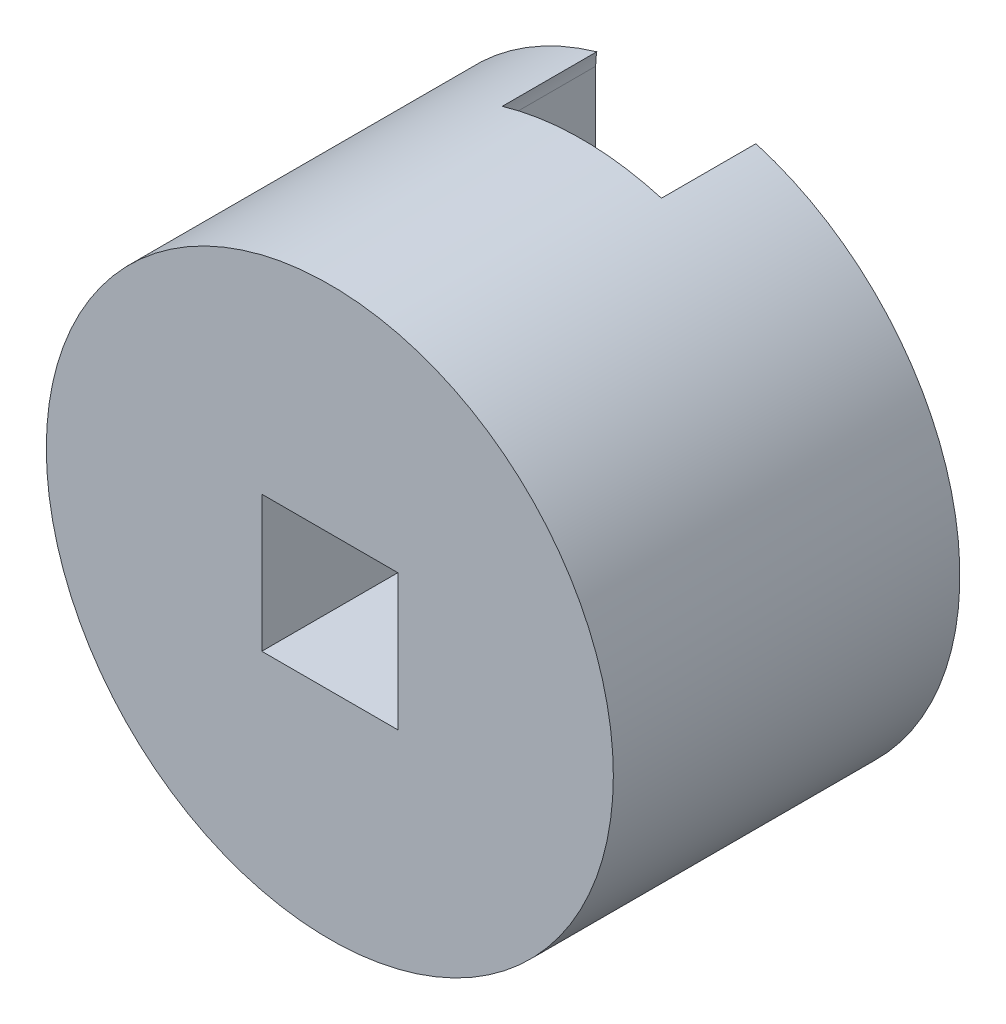
ISO-10303-21;
HEADER;
FILE_DESCRIPTION(('STEP AP214'),'2;1');
FILE_NAME('part.step','',(''),(''),'','','');
FILE_SCHEMA(('AUTOMOTIVE_DESIGN { 1 0 10303 214 1 1 1 1 }'));
ENDSEC;
DATA;
#1=APPLICATION_CONTEXT('core data for automotive mechanical design processes');
#2=APPLICATION_PROTOCOL_DEFINITION('international standard','automotive_design',2000,#1);
#3=PRODUCT_CONTEXT('',#1,'mechanical');
#4=PRODUCT('Part','Part','',(#3));
#5=PRODUCT_RELATED_PRODUCT_CATEGORY('part','',(#4));
#6=PRODUCT_DEFINITION_FORMATION('','',#4);
#7=PRODUCT_DEFINITION_CONTEXT('part definition',#1,'design');
#8=PRODUCT_DEFINITION('design','',#6,#7);
#9=PRODUCT_DEFINITION_SHAPE('','',#8);
#10=(LENGTH_UNIT() NAMED_UNIT(*) SI_UNIT(.MILLI.,.METRE.));
#11=(NAMED_UNIT(*) PLANE_ANGLE_UNIT() SI_UNIT($,.RADIAN.));
#12=(NAMED_UNIT(*) SI_UNIT($,.STERADIAN.) SOLID_ANGLE_UNIT());
#13=UNCERTAINTY_MEASURE_WITH_UNIT(LENGTH_MEASURE(1.E-05),#10,'distance_accuracy_value','');
#14=(GEOMETRIC_REPRESENTATION_CONTEXT(3) GLOBAL_UNCERTAINTY_ASSIGNED_CONTEXT((#13)) GLOBAL_UNIT_ASSIGNED_CONTEXT((#10,
#11,#12)) REPRESENTATION_CONTEXT('',''));
#15=CARTESIAN_POINT('',(0.,0.,0.));
#16=DIRECTION('',(0.,0.,1.));
#17=DIRECTION('',(1.,0.,0.));
#18=AXIS2_PLACEMENT_3D('',#15,#16,#17);
#19=CARTESIAN_POINT('',(0.,5.0927,17.7289));
#20=DIRECTION('',(0.,0.,1.));
#21=DIRECTION('',(1.,0.,0.));
#22=AXIS2_PLACEMENT_3D('',#19,#20,#21);
#23=PLANE('',#22);
#24=CARTESIAN_POINT('',(0.,5.0927,17.7289));
#25=DIRECTION('',(0.,0.,1.));
#26=DIRECTION('',(1.,0.,0.));
#27=AXIS2_PLACEMENT_3D('',#24,#25,#26);
#28=CIRCLE('',#27,7.14375);
#29=CARTESIAN_POINT('',(-2.00523079058413,11.9492453064202,17.7289));
#30=VERTEX_POINT('',#29);
#31=CARTESIAN_POINT('',(-2.00523079058413,-1.76384530642024,17.7289));
#32=VERTEX_POINT('',#31);
#33=EDGE_CURVE('E265',#30,#32,#28,.T.);
#34=ORIENTED_EDGE('',*,*,#33,.F.);
#35=CARTESIAN_POINT('',(0.,11.6205,17.7289));
#36=DIRECTION('',(0.,0.,1.));
#37=DIRECTION('',(1.,0.,0.));
#38=AXIS2_PLACEMENT_3D('',#35,#36,#37);
#39=CIRCLE('',#38,2.032);
#40=CARTESIAN_POINT('',(-2.032,11.6205,17.7289));
#41=VERTEX_POINT('',#40);
#42=EDGE_CURVE('E227',#30,#41,#39,.T.);
#43=ORIENTED_EDGE('',*,*,#42,.T.);
#44=DIRECTION('',(0.,-1.,0.));
#45=VECTOR('',#44,1.);
#46=CARTESIAN_POINT('',(-2.032,11.6205,17.7289));
#47=LINE('',#46,#45);
#48=CARTESIAN_POINT('',(-2.032,8.09704768294217,17.7289));
#49=VERTEX_POINT('',#48);
#50=EDGE_CURVE('E217',#41,#49,#47,.T.);
#51=ORIENTED_EDGE('',*,*,#50,.T.);
#52=CARTESIAN_POINT('',(0.,5.0927,17.7289));
#53=DIRECTION('',(0.,0.,1.));
#54=DIRECTION('',(1.,0.,0.));
#55=AXIS2_PLACEMENT_3D('',#52,#53,#54);
#56=CIRCLE('',#55,3.627);
#57=CARTESIAN_POINT('',(-2.032,2.08835231705783,17.7289));
#58=VERTEX_POINT('',#57);
#59=EDGE_CURVE('E195',#49,#58,#56,.T.);
#60=ORIENTED_EDGE('',*,*,#59,.T.);
#61=DIRECTION('',(0.,-1.,0.));
#62=VECTOR('',#61,1.);
#63=CARTESIAN_POINT('',(-2.032,2.08835231705783,17.7289));
#64=LINE('',#63,#62);
#65=CARTESIAN_POINT('',(-2.032,-1.4351,17.7289));
#66=VERTEX_POINT('',#65);
#67=EDGE_CURVE('E245',#58,#66,#64,.T.);
#68=ORIENTED_EDGE('',*,*,#67,.T.);
#69=CARTESIAN_POINT('',(0.,-1.4351,17.7289));
#70=DIRECTION('',(0.,0.,1.));
#71=DIRECTION('',(1.,0.,0.));
#72=AXIS2_PLACEMENT_3D('',#69,#70,#71);
#73=CIRCLE('',#72,2.032);
#74=EDGE_CURVE('E248',#66,#32,#73,.T.);
#75=ORIENTED_EDGE('',*,*,#74,.T.);
#76=EDGE_LOOP('',(#34,#43,#51,#60,#68,#75));
#77=FACE_BOUND('',#76,.T.);
#78=ADVANCED_FACE('F41',(#77),#23,.F.);
#79=CARTESIAN_POINT('',(2.00523079058413,-1.76384530642024,17.7289));
#80=VERTEX_POINT('',#79);
#81=CARTESIAN_POINT('',(2.00523079058413,11.9492453064202,17.7289));
#82=VERTEX_POINT('',#81);
#83=EDGE_CURVE('E279',#80,#82,#28,.T.);
#84=ORIENTED_EDGE('',*,*,#83,.F.);
#85=CARTESIAN_POINT('',(2.032,-1.4351,17.7289));
#86=VERTEX_POINT('',#85);
#87=EDGE_CURVE('E164',#80,#86,#73,.T.);
#88=ORIENTED_EDGE('',*,*,#87,.T.);
#89=DIRECTION('',(0.,1.,0.));
#90=VECTOR('',#89,1.);
#91=CARTESIAN_POINT('',(2.032,-1.4351,17.7289));
#92=LINE('',#91,#90);
#93=CARTESIAN_POINT('',(2.032,2.08835231705782,17.7289));
#94=VERTEX_POINT('',#93);
#95=EDGE_CURVE('E251',#86,#94,#92,.T.);
#96=ORIENTED_EDGE('',*,*,#95,.T.);
#97=CARTESIAN_POINT('',(0.,5.0927,17.7289));
#98=DIRECTION('',(0.,0.,1.));
#99=DIRECTION('',(1.,0.,0.));
#100=AXIS2_PLACEMENT_3D('',#97,#98,#99);
#101=CIRCLE('',#100,3.627);
#102=CARTESIAN_POINT('',(2.032,8.09704768294217,17.7289));
#103=VERTEX_POINT('',#102);
#104=EDGE_CURVE('E254',#94,#103,#101,.T.);
#105=ORIENTED_EDGE('',*,*,#104,.T.);
#106=DIRECTION('',(0.,1.,0.));
#107=VECTOR('',#106,1.);
#108=CARTESIAN_POINT('',(2.032,8.09704768294217,17.7289));
#109=LINE('',#108,#107);
#110=CARTESIAN_POINT('',(2.032,11.6205,17.7289));
#111=VERTEX_POINT('',#110);
#112=EDGE_CURVE('E257',#103,#111,#109,.T.);
#113=ORIENTED_EDGE('',*,*,#112,.T.);
#114=EDGE_CURVE('E221',#111,#82,#39,.T.);
#115=ORIENTED_EDGE('',*,*,#114,.T.);
#116=EDGE_LOOP('',(#84,#88,#96,#105,#113,#115));
#117=FACE_BOUND('',#116,.T.);
#118=ADVANCED_FACE('F343',(#117),#23,.F.);
#119=CARTESIAN_POINT('',(0.,11.6205,17.7289));
#120=DIRECTION('',(0.,0.,1.));
#121=DIRECTION('',(1.,0.,0.));
#122=AXIS2_PLACEMENT_3D('',#119,#120,#121);
#123=CYLINDRICAL_SURFACE('',#122,2.032);
#124=DIRECTION('',(0.,0.,-1.));
#125=VECTOR('',#124,1.);
#126=CARTESIAN_POINT('',(2.00523079058413,11.9492453064202,22.094519));
#127=LINE('',#126,#125);
#128=CARTESIAN_POINT('',(2.00523079058413,11.9492453064202,20.11015));
#129=VERTEX_POINT('',#128);
#130=EDGE_CURVE('E286',#82,#129,#127,.F.);
#131=ORIENTED_EDGE('',*,*,#130,.F.);
#132=ORIENTED_EDGE('',*,*,#114,.F.);
#133=DIRECTION('',(0.,0.,1.));
#134=VECTOR('',#133,1.);
#135=CARTESIAN_POINT('',(2.032,11.6205,17.7289));
#136=LINE('',#135,#134);
#137=CARTESIAN_POINT('',(2.032,11.6205,20.11015));
#138=VERTEX_POINT('',#137);
#139=EDGE_CURVE('E201',#111,#138,#136,.T.);
#140=ORIENTED_EDGE('',*,*,#139,.T.);
#141=CARTESIAN_POINT('',(0.,11.6205,20.11015));
#142=DIRECTION('',(0.,0.,1.));
#143=DIRECTION('',(1.,0.,0.));
#144=AXIS2_PLACEMENT_3D('',#141,#142,#143);
#145=CIRCLE('',#144,2.032);
#146=EDGE_CURVE('E188',#138,#129,#145,.T.);
#147=ORIENTED_EDGE('',*,*,#146,.T.);
#148=EDGE_LOOP('',(#131,#132,#140,#147));
#149=FACE_BOUND('',#148,.T.);
#150=ADVANCED_FACE('F347',(#149),#123,.F.);
#151=DIRECTION('',(0.,0.,-1.));
#152=VECTOR('',#151,1.);
#153=CARTESIAN_POINT('',(-2.00523079058413,11.9492453064202,22.094519));
#154=LINE('',#153,#152);
#155=CARTESIAN_POINT('',(-2.00523079058413,11.9492453064202,20.11015));
#156=VERTEX_POINT('',#155);
#157=EDGE_CURVE('E284',#156,#30,#154,.T.);
#158=ORIENTED_EDGE('',*,*,#157,.F.);
#159=CARTESIAN_POINT('',(-2.032,11.6205,20.11015));
#160=VERTEX_POINT('',#159);
#161=EDGE_CURVE('E187',#156,#160,#145,.T.);
#162=ORIENTED_EDGE('',*,*,#161,.T.);
#163=DIRECTION('',(0.,0.,1.));
#164=VECTOR('',#163,1.);
#165=CARTESIAN_POINT('',(-2.032,11.6205,17.7289));
#166=LINE('',#165,#164);
#167=EDGE_CURVE('E198',#41,#160,#166,.T.);
#168=ORIENTED_EDGE('',*,*,#167,.F.);
#169=ORIENTED_EDGE('',*,*,#42,.F.);
#170=EDGE_LOOP('',(#158,#162,#168,#169));
#171=FACE_BOUND('',#170,.T.);
#172=ADVANCED_FACE('F268',(#171),#123,.F.);
#173=CARTESIAN_POINT('',(0.,-1.4351,17.7289));
#174=DIRECTION('',(0.,0.,1.));
#175=DIRECTION('',(1.,0.,0.));
#176=AXIS2_PLACEMENT_3D('',#173,#174,#175);
#177=CYLINDRICAL_SURFACE('',#176,2.032);
#178=DIRECTION('',(0.,0.,-1.));
#179=VECTOR('',#178,1.);
#180=CARTESIAN_POINT('',(-2.00523079058413,-1.76384530642024,22.094519));
#181=LINE('',#180,#179);
#182=CARTESIAN_POINT('',(-2.00523079058413,-1.76384530642024,20.11015));
#183=VERTEX_POINT('',#182);
#184=EDGE_CURVE('E55',#32,#183,#181,.F.);
#185=ORIENTED_EDGE('',*,*,#184,.F.);
#186=ORIENTED_EDGE('',*,*,#74,.F.);
#187=DIRECTION('',(0.,0.,1.));
#188=VECTOR('',#187,1.);
#189=CARTESIAN_POINT('',(-2.032,-1.4351,17.7289));
#190=LINE('',#189,#188);
#191=CARTESIAN_POINT('',(-2.032,-1.4351,20.11015));
#192=VERTEX_POINT('',#191);
#193=EDGE_CURVE('E213',#66,#192,#190,.T.);
#194=ORIENTED_EDGE('',*,*,#193,.T.);
#195=CARTESIAN_POINT('',(0.,-1.4351,20.11015));
#196=DIRECTION('',(0.,0.,1.));
#197=DIRECTION('',(1.,0.,0.));
#198=AXIS2_PLACEMENT_3D('',#195,#196,#197);
#199=CIRCLE('',#198,2.032);
#200=EDGE_CURVE('E172',#192,#183,#199,.T.);
#201=ORIENTED_EDGE('',*,*,#200,.T.);
#202=EDGE_LOOP('',(#185,#186,#194,#201));
#203=FACE_BOUND('',#202,.T.);
#204=ADVANCED_FACE('F278',(#203),#177,.F.);
#205=DIRECTION('',(0.,0.,-1.));
#206=VECTOR('',#205,1.);
#207=CARTESIAN_POINT('',(2.00523079058413,-1.76384530642024,22.094519));
#208=LINE('',#207,#206);
#209=CARTESIAN_POINT('',(2.00523079058413,-1.76384530642024,20.11015));
#210=VERTEX_POINT('',#209);
#211=EDGE_CURVE('E152',#210,#80,#208,.T.);
#212=ORIENTED_EDGE('',*,*,#211,.F.);
#213=CARTESIAN_POINT('',(2.032,-1.4351,20.11015));
#214=VERTEX_POINT('',#213);
#215=EDGE_CURVE('E162',#210,#214,#199,.T.);
#216=ORIENTED_EDGE('',*,*,#215,.T.);
#217=DIRECTION('',(0.,0.,1.));
#218=VECTOR('',#217,1.);
#219=CARTESIAN_POINT('',(2.032,-1.4351,17.7289));
#220=LINE('',#219,#218);
#221=EDGE_CURVE('E211',#86,#214,#220,.T.);
#222=ORIENTED_EDGE('',*,*,#221,.F.);
#223=ORIENTED_EDGE('',*,*,#87,.F.);
#224=EDGE_LOOP('',(#212,#216,#222,#223));
#225=FACE_BOUND('',#224,.T.);
#226=ADVANCED_FACE('F160',(#225),#177,.F.);
#227=CARTESIAN_POINT('',(0.,5.0927,26.46015));
#228=DIRECTION('',(0.,0.,1.));
#229=DIRECTION('',(1.,0.,0.));
#230=AXIS2_PLACEMENT_3D('',#227,#228,#229);
#231=PLANE('',#230);
#232=DIRECTION('',(0.,1.,0.));
#233=VECTOR('',#232,1.);
#234=CARTESIAN_POINT('',(1.7145,3.3782,26.46015));
#235=LINE('',#234,#233);
#236=CARTESIAN_POINT('',(1.7145,3.3782,26.46015));
#237=VERTEX_POINT('',#236);
#238=CARTESIAN_POINT('',(1.7145,6.8072,26.46015));
#239=VERTEX_POINT('',#238);
#240=EDGE_CURVE('E305',#237,#239,#235,.T.);
#241=ORIENTED_EDGE('',*,*,#240,.F.);
#242=DIRECTION('',(1.,0.,0.));
#243=VECTOR('',#242,1.);
#244=CARTESIAN_POINT('',(-1.7145,3.3782,26.46015));
#245=LINE('',#244,#243);
#246=CARTESIAN_POINT('',(-1.7145,3.3782,26.46015));
#247=VERTEX_POINT('',#246);
#248=EDGE_CURVE('E303',#247,#237,#245,.T.);
#249=ORIENTED_EDGE('',*,*,#248,.F.);
#250=DIRECTION('',(0.,-1.,0.));
#251=VECTOR('',#250,1.);
#252=CARTESIAN_POINT('',(-1.7145,6.8072,26.46015));
#253=LINE('',#252,#251);
#254=CARTESIAN_POINT('',(-1.7145,6.8072,26.46015));
#255=VERTEX_POINT('',#254);
#256=EDGE_CURVE('E310',#255,#247,#253,.T.);
#257=ORIENTED_EDGE('',*,*,#256,.F.);
#258=DIRECTION('',(-1.,0.,0.));
#259=VECTOR('',#258,1.);
#260=CARTESIAN_POINT('',(1.7145,6.8072,26.46015));
#261=LINE('',#260,#259);
#262=EDGE_CURVE('E307',#239,#255,#261,.T.);
#263=ORIENTED_EDGE('',*,*,#262,.F.);
#264=EDGE_LOOP('',(#241,#249,#257,#263));
#265=FACE_BOUND('',#264,.T.);
#266=CARTESIAN_POINT('',(0.,5.0927,26.46015));
#267=DIRECTION('',(0.,0.,-1.));
#268=DIRECTION('',(-1.,0.,0.));
#269=AXIS2_PLACEMENT_3D('',#266,#267,#268);
#270=CIRCLE('',#269,7.14375);
#271=CARTESIAN_POINT('',(-7.14375,5.0927,26.46015));
#272=VERTEX_POINT('',#271);
#273=EDGE_CURVE('E165',#272,#272,#270,.T.);
#274=ORIENTED_EDGE('',*,*,#273,.F.);
#275=EDGE_LOOP('',(#274));
#276=FACE_BOUND('',#275,.T.);
#277=ADVANCED_FACE('F330',(#265,#276),#231,.T.);
#278=CARTESIAN_POINT('',(0.,5.0927,20.11015));
#279=DIRECTION('',(0.,0.,1.));
#280=DIRECTION('',(1.,0.,0.));
#281=AXIS2_PLACEMENT_3D('',#278,#279,#280);
#282=PLANE('',#281);
#283=CARTESIAN_POINT('',(0.,5.0927,20.11015));
#284=DIRECTION('',(0.,0.,-1.));
#285=DIRECTION('',(-1.,0.,0.));
#286=AXIS2_PLACEMENT_3D('',#283,#284,#285);
#287=CIRCLE('',#286,1.25);
#288=CARTESIAN_POINT('',(-1.25,5.0927,20.11015));
#289=VERTEX_POINT('',#288);
#290=EDGE_CURVE('E288',#289,#289,#287,.T.);
#291=ORIENTED_EDGE('',*,*,#290,.F.);
#292=EDGE_LOOP('',(#291));
#293=FACE_BOUND('',#292,.T.);
#294=CARTESIAN_POINT('',(0.,5.0927,20.11015));
#295=DIRECTION('',(0.,0.,1.));
#296=DIRECTION('',(1.,0.,0.));
#297=AXIS2_PLACEMENT_3D('',#294,#295,#296);
#298=CIRCLE('',#297,7.14375);
#299=EDGE_CURVE('E12',#129,#156,#298,.T.);
#300=ORIENTED_EDGE('',*,*,#299,.F.);
#301=ORIENTED_EDGE('',*,*,#146,.F.);
#302=DIRECTION('',(0.,1.,0.));
#303=VECTOR('',#302,1.);
#304=CARTESIAN_POINT('',(2.032,8.09704768294217,20.11015));
#305=LINE('',#304,#303);
#306=CARTESIAN_POINT('',(2.032,8.09704768294217,20.11015));
#307=VERTEX_POINT('',#306);
#308=EDGE_CURVE('E184',#307,#138,#305,.T.);
#309=ORIENTED_EDGE('',*,*,#308,.F.);
#310=CARTESIAN_POINT('',(0.,5.0927,20.11015));
#311=DIRECTION('',(0.,0.,1.));
#312=DIRECTION('',(1.,0.,0.));
#313=AXIS2_PLACEMENT_3D('',#310,#311,#312);
#314=CIRCLE('',#313,3.627);
#315=CARTESIAN_POINT('',(2.032,2.08835231705782,20.11015));
#316=VERTEX_POINT('',#315);
#317=EDGE_CURVE('E181',#316,#307,#314,.T.);
#318=ORIENTED_EDGE('',*,*,#317,.F.);
#319=DIRECTION('',(0.,1.,0.));
#320=VECTOR('',#319,1.);
#321=CARTESIAN_POINT('',(2.032,-1.4351,20.11015));
#322=LINE('',#321,#320);
#323=EDGE_CURVE('E170',#214,#316,#322,.T.);
#324=ORIENTED_EDGE('',*,*,#323,.F.);
#325=ORIENTED_EDGE('',*,*,#215,.F.);
#326=EDGE_CURVE('E44',#183,#210,#298,.T.);
#327=ORIENTED_EDGE('',*,*,#326,.F.);
#328=ORIENTED_EDGE('',*,*,#200,.F.);
#329=DIRECTION('',(0.,-1.,0.));
#330=VECTOR('',#329,1.);
#331=CARTESIAN_POINT('',(-2.032,2.08835231705783,20.11015));
#332=LINE('',#331,#330);
#333=CARTESIAN_POINT('',(-2.032,2.08835231705783,20.11015));
#334=VERTEX_POINT('',#333);
#335=EDGE_CURVE('E173',#334,#192,#332,.T.);
#336=ORIENTED_EDGE('',*,*,#335,.F.);
#337=CARTESIAN_POINT('',(0.,5.0927,20.11015));
#338=DIRECTION('',(0.,0.,1.));
#339=DIRECTION('',(1.,0.,0.));
#340=AXIS2_PLACEMENT_3D('',#337,#338,#339);
#341=CIRCLE('',#340,3.627);
#342=CARTESIAN_POINT('',(-2.032,8.09704768294217,20.11015));
#343=VERTEX_POINT('',#342);
#344=EDGE_CURVE('E176',#343,#334,#341,.T.);
#345=ORIENTED_EDGE('',*,*,#344,.F.);
#346=DIRECTION('',(0.,-1.,0.));
#347=VECTOR('',#346,1.);
#348=CARTESIAN_POINT('',(-2.032,11.6205,20.11015));
#349=LINE('',#348,#347);
#350=EDGE_CURVE('E191',#160,#343,#349,.T.);
#351=ORIENTED_EDGE('',*,*,#350,.F.);
#352=ORIENTED_EDGE('',*,*,#161,.F.);
#353=EDGE_LOOP('',(#300,#301,#309,#318,#324,#325,#327,#328,#336,#345,#351,#352));
#354=FACE_BOUND('',#353,.T.);
#355=ADVANCED_FACE('F168',(#293,#354),#282,.F.);
#356=CARTESIAN_POINT('',(-1.7145,3.3782,26.46015));
#357=DIRECTION('',(0.,1.,0.));
#358=DIRECTION('',(0.,0.,1.));
#359=AXIS2_PLACEMENT_3D('',#356,#357,#358);
#360=PLANE('',#359);
#361=DIRECTION('',(0.,0.,-1.));
#362=VECTOR('',#361,1.);
#363=CARTESIAN_POINT('',(1.7145,3.3782,26.46015));
#364=LINE('',#363,#362);
#365=CARTESIAN_POINT('',(1.7145,3.3782,21.11015));
#366=VERTEX_POINT('',#365);
#367=EDGE_CURVE('E231',#237,#366,#364,.T.);
#368=ORIENTED_EDGE('',*,*,#367,.T.);
#369=DIRECTION('',(-1.,0.,0.));
#370=VECTOR('',#369,1.);
#371=CARTESIAN_POINT('',(1.7145,3.3782,21.11015));
#372=LINE('',#371,#370);
#373=CARTESIAN_POINT('',(-1.7145,3.3782,21.11015));
#374=VERTEX_POINT('',#373);
#375=EDGE_CURVE('E301',#366,#374,#372,.T.);
#376=ORIENTED_EDGE('',*,*,#375,.T.);
#377=DIRECTION('',(0.,0.,-1.));
#378=VECTOR('',#377,1.);
#379=CARTESIAN_POINT('',(-1.7145,3.3782,26.46015));
#380=LINE('',#379,#378);
#381=EDGE_CURVE('E312',#247,#374,#380,.T.);
#382=ORIENTED_EDGE('',*,*,#381,.F.);
#383=ORIENTED_EDGE('',*,*,#248,.T.);
#384=EDGE_LOOP('',(#368,#376,#382,#383));
#385=FACE_BOUND('',#384,.T.);
#386=ADVANCED_FACE('F326',(#385),#360,.T.);
#387=CARTESIAN_POINT('',(1.7145,3.3782,26.46015));
#388=DIRECTION('',(-1.,0.,0.));
#389=DIRECTION('',(0.,0.,1.));
#390=AXIS2_PLACEMENT_3D('',#387,#388,#389);
#391=PLANE('',#390);
#392=DIRECTION('',(0.,0.,-1.));
#393=VECTOR('',#392,1.);
#394=CARTESIAN_POINT('',(1.7145,6.8072,26.46015));
#395=LINE('',#394,#393);
#396=CARTESIAN_POINT('',(1.7145,6.8072,21.11015));
#397=VERTEX_POINT('',#396);
#398=EDGE_CURVE('E234',#239,#397,#395,.T.);
#399=ORIENTED_EDGE('',*,*,#398,.T.);
#400=DIRECTION('',(0.,-1.,0.));
#401=VECTOR('',#400,1.);
#402=CARTESIAN_POINT('',(1.7145,6.8072,21.11015));
#403=LINE('',#402,#401);
#404=EDGE_CURVE('E298',#397,#366,#403,.T.);
#405=ORIENTED_EDGE('',*,*,#404,.T.);
#406=ORIENTED_EDGE('',*,*,#367,.F.);
#407=ORIENTED_EDGE('',*,*,#240,.T.);
#408=EDGE_LOOP('',(#399,#405,#406,#407));
#409=FACE_BOUND('',#408,.T.);
#410=ADVANCED_FACE('F333',(#409),#391,.T.);
#411=CARTESIAN_POINT('',(1.7145,6.8072,26.46015));
#412=DIRECTION('',(0.,-1.,0.));
#413=DIRECTION('',(0.,0.,-1.));
#414=AXIS2_PLACEMENT_3D('',#411,#412,#413);
#415=PLANE('',#414);
#416=DIRECTION('',(0.,0.,-1.));
#417=VECTOR('',#416,1.);
#418=CARTESIAN_POINT('',(-1.7145,6.8072,26.46015));
#419=LINE('',#418,#417);
#420=CARTESIAN_POINT('',(-1.7145,6.8072,21.11015));
#421=VERTEX_POINT('',#420);
#422=EDGE_CURVE('E240',#255,#421,#419,.T.);
#423=ORIENTED_EDGE('',*,*,#422,.T.);
#424=DIRECTION('',(1.,0.,0.));
#425=VECTOR('',#424,1.);
#426=CARTESIAN_POINT('',(-1.7145,6.8072,21.11015));
#427=LINE('',#426,#425);
#428=EDGE_CURVE('E63',#421,#397,#427,.T.);
#429=ORIENTED_EDGE('',*,*,#428,.T.);
#430=ORIENTED_EDGE('',*,*,#398,.F.);
#431=ORIENTED_EDGE('',*,*,#262,.T.);
#432=EDGE_LOOP('',(#423,#429,#430,#431));
#433=FACE_BOUND('',#432,.T.);
#434=ADVANCED_FACE('F318',(#433),#415,.T.);
#435=CARTESIAN_POINT('',(-1.7145,6.8072,26.46015));
#436=DIRECTION('',(1.,0.,0.));
#437=DIRECTION('',(0.,0.,-1.));
#438=AXIS2_PLACEMENT_3D('',#435,#436,#437);
#439=PLANE('',#438);
#440=ORIENTED_EDGE('',*,*,#381,.T.);
#441=DIRECTION('',(0.,1.,0.));
#442=VECTOR('',#441,1.);
#443=CARTESIAN_POINT('',(-1.7145,3.3782,21.11015));
#444=LINE('',#443,#442);
#445=EDGE_CURVE('E292',#374,#421,#444,.T.);
#446=ORIENTED_EDGE('',*,*,#445,.T.);
#447=ORIENTED_EDGE('',*,*,#422,.F.);
#448=ORIENTED_EDGE('',*,*,#256,.T.);
#449=EDGE_LOOP('',(#440,#446,#447,#448));
#450=FACE_BOUND('',#449,.T.);
#451=ADVANCED_FACE('F323',(#450),#439,.T.);
#452=CARTESIAN_POINT('',(0.,5.0927,17.7289));
#453=DIRECTION('',(0.,0.,1.));
#454=DIRECTION('',(1.,0.,0.));
#455=AXIS2_PLACEMENT_3D('',#452,#453,#454);
#456=CYLINDRICAL_SURFACE('',#455,3.627);
#457=ORIENTED_EDGE('',*,*,#344,.T.);
#458=DIRECTION('',(0.,0.,1.));
#459=VECTOR('',#458,1.);
#460=CARTESIAN_POINT('',(-2.032,2.08835231705783,17.7289));
#461=LINE('',#460,#459);
#462=EDGE_CURVE('E215',#58,#334,#461,.T.);
#463=ORIENTED_EDGE('',*,*,#462,.F.);
#464=ORIENTED_EDGE('',*,*,#59,.F.);
#465=DIRECTION('',(0.,0.,1.));
#466=VECTOR('',#465,1.);
#467=CARTESIAN_POINT('',(-2.032,8.09704768294217,17.7289));
#468=LINE('',#467,#466);
#469=EDGE_CURVE('E157',#49,#343,#468,.T.);
#470=ORIENTED_EDGE('',*,*,#469,.T.);
#471=EDGE_LOOP('',(#457,#463,#464,#470));
#472=FACE_BOUND('',#471,.T.);
#473=ADVANCED_FACE('F274',(#472),#456,.F.);
#474=CARTESIAN_POINT('',(-2.032,11.6205,17.7289));
#475=DIRECTION('',(-1.,0.,0.));
#476=DIRECTION('',(0.,0.,1.));
#477=AXIS2_PLACEMENT_3D('',#474,#475,#476);
#478=PLANE('',#477);
#479=ORIENTED_EDGE('',*,*,#350,.T.);
#480=ORIENTED_EDGE('',*,*,#469,.F.);
#481=ORIENTED_EDGE('',*,*,#50,.F.);
#482=ORIENTED_EDGE('',*,*,#167,.T.);
#483=EDGE_LOOP('',(#479,#480,#481,#482));
#484=FACE_BOUND('',#483,.T.);
#485=ADVANCED_FACE('F272',(#484),#478,.F.);
#486=CARTESIAN_POINT('',(2.032,8.09704768294217,17.7289));
#487=DIRECTION('',(1.,0.,0.));
#488=DIRECTION('',(0.,1.,0.));
#489=AXIS2_PLACEMENT_3D('',#486,#487,#488);
#490=PLANE('',#489);
#491=ORIENTED_EDGE('',*,*,#308,.T.);
#492=ORIENTED_EDGE('',*,*,#139,.F.);
#493=ORIENTED_EDGE('',*,*,#112,.F.);
#494=DIRECTION('',(0.,0.,1.));
#495=VECTOR('',#494,1.);
#496=CARTESIAN_POINT('',(2.032,8.09704768294217,17.7289));
#497=LINE('',#496,#495);
#498=EDGE_CURVE('E204',#103,#307,#497,.T.);
#499=ORIENTED_EDGE('',*,*,#498,.T.);
#500=EDGE_LOOP('',(#491,#492,#493,#499));
#501=FACE_BOUND('',#500,.T.);
#502=ADVANCED_FACE('F356',(#501),#490,.F.);
#503=CARTESIAN_POINT('',(0.,5.0927,17.7289));
#504=DIRECTION('',(0.,0.,1.));
#505=DIRECTION('',(1.,0.,0.));
#506=AXIS2_PLACEMENT_3D('',#503,#504,#505);
#507=CYLINDRICAL_SURFACE('',#506,3.627);
#508=ORIENTED_EDGE('',*,*,#317,.T.);
#509=ORIENTED_EDGE('',*,*,#498,.F.);
#510=ORIENTED_EDGE('',*,*,#104,.F.);
#511=DIRECTION('',(0.,0.,1.));
#512=VECTOR('',#511,1.);
#513=CARTESIAN_POINT('',(2.032,2.08835231705782,17.7289));
#514=LINE('',#513,#512);
#515=EDGE_CURVE('E208',#94,#316,#514,.T.);
#516=ORIENTED_EDGE('',*,*,#515,.T.);
#517=EDGE_LOOP('',(#508,#509,#510,#516));
#518=FACE_BOUND('',#517,.T.);
#519=ADVANCED_FACE('F359',(#518),#507,.F.);
#520=CARTESIAN_POINT('',(2.032,-1.4351,17.7289));
#521=DIRECTION('',(1.,0.,0.));
#522=DIRECTION('',(0.,1.,0.));
#523=AXIS2_PLACEMENT_3D('',#520,#521,#522);
#524=PLANE('',#523);
#525=ORIENTED_EDGE('',*,*,#323,.T.);
#526=ORIENTED_EDGE('',*,*,#515,.F.);
#527=ORIENTED_EDGE('',*,*,#95,.F.);
#528=ORIENTED_EDGE('',*,*,#221,.T.);
#529=EDGE_LOOP('',(#525,#526,#527,#528));
#530=FACE_BOUND('',#529,.T.);
#531=ADVANCED_FACE('F362',(#530),#524,.F.);
#532=CARTESIAN_POINT('',(-2.032,2.08835231705783,17.7289));
#533=DIRECTION('',(-1.,0.,0.));
#534=DIRECTION('',(0.,-1.,0.));
#535=AXIS2_PLACEMENT_3D('',#532,#533,#534);
#536=PLANE('',#535);
#537=ORIENTED_EDGE('',*,*,#335,.T.);
#538=ORIENTED_EDGE('',*,*,#193,.F.);
#539=ORIENTED_EDGE('',*,*,#67,.F.);
#540=ORIENTED_EDGE('',*,*,#462,.T.);
#541=EDGE_LOOP('',(#537,#538,#539,#540));
#542=FACE_BOUND('',#541,.T.);
#543=ADVANCED_FACE('F276',(#542),#536,.F.);
#544=CARTESIAN_POINT('',(0.,0.,21.11015));
#545=DIRECTION('',(0.,0.,-1.));
#546=DIRECTION('',(-1.,0.,0.));
#547=AXIS2_PLACEMENT_3D('',#544,#545,#546);
#548=PLANE('',#547);
#549=CARTESIAN_POINT('',(0.,5.0927,21.11015));
#550=DIRECTION('',(0.,0.,-1.));
#551=DIRECTION('',(-1.,0.,0.));
#552=AXIS2_PLACEMENT_3D('',#549,#550,#551);
#553=CIRCLE('',#552,1.25);
#554=CARTESIAN_POINT('',(-1.25,5.0927,21.11015));
#555=VERTEX_POINT('',#554);
#556=EDGE_CURVE('E289',#555,#555,#553,.T.);
#557=ORIENTED_EDGE('',*,*,#556,.T.);
#558=EDGE_LOOP('',(#557));
#559=FACE_BOUND('',#558,.T.);
#560=ORIENTED_EDGE('',*,*,#445,.F.);
#561=ORIENTED_EDGE('',*,*,#375,.F.);
#562=ORIENTED_EDGE('',*,*,#404,.F.);
#563=ORIENTED_EDGE('',*,*,#428,.F.);
#564=EDGE_LOOP('',(#560,#561,#562,#563));
#565=FACE_BOUND('',#564,.T.);
#566=ADVANCED_FACE('F325',(#559,#565),#548,.F.);
#567=CARTESIAN_POINT('',(0.,5.0927,21.11015));
#568=DIRECTION('',(0.,0.,-1.));
#569=DIRECTION('',(-1.,0.,0.));
#570=AXIS2_PLACEMENT_3D('',#567,#568,#569);
#571=CYLINDRICAL_SURFACE('',#570,1.25);
#572=ORIENTED_EDGE('',*,*,#556,.F.);
#573=EDGE_LOOP('',(#572));
#574=FACE_BOUND('',#573,.T.);
#575=ORIENTED_EDGE('',*,*,#290,.T.);
#576=EDGE_LOOP('',(#575));
#577=FACE_BOUND('',#576,.T.);
#578=ADVANCED_FACE('F386',(#574,#577),#571,.F.);
#579=CARTESIAN_POINT('',(0.,5.0927,26.46015));
#580=DIRECTION('',(0.,0.,-1.));
#581=DIRECTION('',(-1.,0.,0.));
#582=AXIS2_PLACEMENT_3D('',#579,#580,#581);
#583=CYLINDRICAL_SURFACE('',#582,7.14375);
#584=ORIENTED_EDGE('',*,*,#273,.T.);
#585=EDGE_LOOP('',(#584));
#586=FACE_BOUND('',#585,.T.);
#587=ORIENTED_EDGE('',*,*,#299,.T.);
#588=ORIENTED_EDGE('',*,*,#157,.T.);
#589=ORIENTED_EDGE('',*,*,#33,.T.);
#590=ORIENTED_EDGE('',*,*,#184,.T.);
#591=ORIENTED_EDGE('',*,*,#326,.T.);
#592=ORIENTED_EDGE('',*,*,#211,.T.);
#593=ORIENTED_EDGE('',*,*,#83,.T.);
#594=ORIENTED_EDGE('',*,*,#130,.T.);
#595=EDGE_LOOP('',(#587,#588,#589,#590,#591,#592,#593,#594));
#596=FACE_BOUND('',#595,.T.);
#597=ADVANCED_FACE('F151',(#586,#596),#583,.T.);
#598=CLOSED_SHELL('',(#78,#118,#150,#172,#204,#226,#277,#355,#386,#410,#434,#451,#473,#485,#502,
#519,#531,#543,#566,#578,#597));
#599=MANIFOLD_SOLID_BREP('B2',#598);
#600=ADVANCED_BREP_SHAPE_REPRESENTATION('',(#18,#599),#14);
#601=SHAPE_DEFINITION_REPRESENTATION(#9,#600);
ENDSEC;
END-ISO-10303-21;
